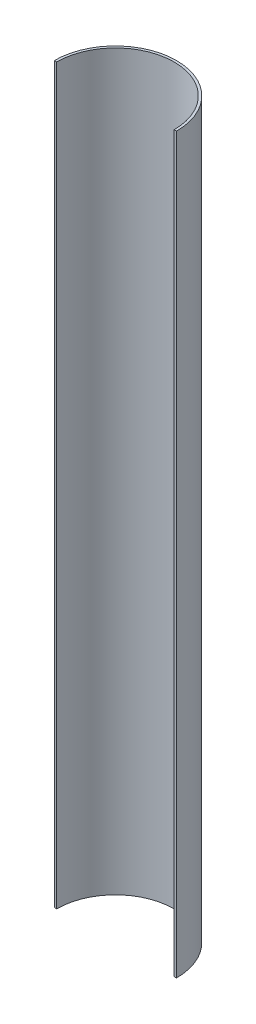
ISO-10303-21;
HEADER;
FILE_DESCRIPTION(('STEP AP214'),'2;1');
FILE_NAME('part.step','',(''),(''),'','','');
FILE_SCHEMA(('AUTOMOTIVE_DESIGN { 1 0 10303 214 1 1 1 1 }'));
ENDSEC;
DATA;
#1=APPLICATION_CONTEXT('core data for automotive mechanical design processes');
#2=APPLICATION_PROTOCOL_DEFINITION('international standard','automotive_design',2000,#1);
#3=PRODUCT_CONTEXT('',#1,'mechanical');
#4=PRODUCT('Part','Part','',(#3));
#5=PRODUCT_RELATED_PRODUCT_CATEGORY('part','',(#4));
#6=PRODUCT_DEFINITION_FORMATION('','',#4);
#7=PRODUCT_DEFINITION_CONTEXT('part definition',#1,'design');
#8=PRODUCT_DEFINITION('design','',#6,#7);
#9=PRODUCT_DEFINITION_SHAPE('','',#8);
#10=(LENGTH_UNIT() NAMED_UNIT(*) SI_UNIT(.MILLI.,.METRE.));
#11=(NAMED_UNIT(*) PLANE_ANGLE_UNIT() SI_UNIT($,.RADIAN.));
#12=(NAMED_UNIT(*) SI_UNIT($,.STERADIAN.) SOLID_ANGLE_UNIT());
#13=UNCERTAINTY_MEASURE_WITH_UNIT(LENGTH_MEASURE(1.E-05),#10,'distance_accuracy_value','');
#14=(GEOMETRIC_REPRESENTATION_CONTEXT(3) GLOBAL_UNCERTAINTY_ASSIGNED_CONTEXT((#13)) GLOBAL_UNIT_ASSIGNED_CONTEXT((#10,
#11,#12)) REPRESENTATION_CONTEXT('',''));
#15=CARTESIAN_POINT('',(0.,0.,0.));
#16=DIRECTION('',(0.,0.,1.));
#17=DIRECTION('',(1.,0.,0.));
#18=AXIS2_PLACEMENT_3D('',#15,#16,#17);
#19=CARTESIAN_POINT('',(0.,1500.,0.));
#20=DIRECTION('',(0.,0.,-1.));
#21=DIRECTION('',(-1.,0.,0.));
#22=AXIS2_PLACEMENT_3D('',#19,#20,#21);
#23=PLANE('',#22);
#24=DIRECTION('',(1.,0.,0.));
#25=VECTOR('',#24,1.);
#26=CARTESIAN_POINT('',(0.,0.,0.));
#27=LINE('',#26,#25);
#28=CARTESIAN_POINT('',(120.,0.,0.));
#29=VERTEX_POINT('',#28);
#30=CARTESIAN_POINT('',(125.,0.,0.));
#31=VERTEX_POINT('',#30);
#32=EDGE_CURVE('E116',#29,#31,#27,.T.);
#33=ORIENTED_EDGE('',*,*,#32,.T.);
#34=DIRECTION('',(0.,-1.,0.));
#35=VECTOR('',#34,1.);
#36=CARTESIAN_POINT('',(125.,1500.,0.));
#37=LINE('',#36,#35);
#38=CARTESIAN_POINT('',(125.,1500.,0.));
#39=VERTEX_POINT('',#38);
#40=EDGE_CURVE('E11',#39,#31,#37,.T.);
#41=ORIENTED_EDGE('',*,*,#40,.F.);
#42=DIRECTION('',(1.,0.,0.));
#43=VECTOR('',#42,1.);
#44=CARTESIAN_POINT('',(0.,1500.,0.));
#45=LINE('',#44,#43);
#46=CARTESIAN_POINT('',(120.,1500.,0.));
#47=VERTEX_POINT('',#46);
#48=EDGE_CURVE('E92',#47,#39,#45,.T.);
#49=ORIENTED_EDGE('',*,*,#48,.F.);
#50=DIRECTION('',(0.,-1.,0.));
#51=VECTOR('',#50,1.);
#52=CARTESIAN_POINT('',(120.,1500.,0.));
#53=LINE('',#52,#51);
#54=EDGE_CURVE('E59',#47,#29,#53,.T.);
#55=ORIENTED_EDGE('',*,*,#54,.T.);
#56=EDGE_LOOP('',(#33,#41,#49,#55));
#57=FACE_BOUND('',#56,.T.);
#58=ADVANCED_FACE('F41',(#57),#23,.F.);
#59=CARTESIAN_POINT('',(0.,1500.,0.));
#60=DIRECTION('',(0.,-1.,0.));
#61=DIRECTION('',(0.,0.,-1.));
#62=AXIS2_PLACEMENT_3D('',#59,#60,#61);
#63=CYLINDRICAL_SURFACE('',#62,125.);
#64=CARTESIAN_POINT('',(0.,0.,0.));
#65=DIRECTION('',(0.,1.,0.));
#66=DIRECTION('',(0.,0.,1.));
#67=AXIS2_PLACEMENT_3D('',#64,#65,#66);
#68=CIRCLE('',#67,125.);
#69=CARTESIAN_POINT('',(-125.,0.,0.));
#70=VERTEX_POINT('',#69);
#71=EDGE_CURVE('E97',#31,#70,#68,.T.);
#72=ORIENTED_EDGE('',*,*,#71,.T.);
#73=DIRECTION('',(0.,-1.,0.));
#74=VECTOR('',#73,1.);
#75=CARTESIAN_POINT('',(-125.,1500.,0.));
#76=LINE('',#75,#74);
#77=CARTESIAN_POINT('',(-125.,1500.,0.));
#78=VERTEX_POINT('',#77);
#79=EDGE_CURVE('E51',#78,#70,#76,.T.);
#80=ORIENTED_EDGE('',*,*,#79,.F.);
#81=CARTESIAN_POINT('',(0.,1500.,0.));
#82=DIRECTION('',(0.,1.,0.));
#83=DIRECTION('',(0.,0.,1.));
#84=AXIS2_PLACEMENT_3D('',#81,#82,#83);
#85=CIRCLE('',#84,125.);
#86=EDGE_CURVE('E85',#39,#78,#85,.T.);
#87=ORIENTED_EDGE('',*,*,#86,.F.);
#88=ORIENTED_EDGE('',*,*,#40,.T.);
#89=EDGE_LOOP('',(#72,#80,#87,#88));
#90=FACE_BOUND('',#89,.T.);
#91=ADVANCED_FACE('F43',(#90),#63,.T.);
#92=CARTESIAN_POINT('',(-120.,0.,0.));
#93=VERTEX_POINT('',#92);
#94=EDGE_CURVE('E111',#70,#93,#27,.T.);
#95=ORIENTED_EDGE('',*,*,#94,.T.);
#96=DIRECTION('',(0.,-1.,0.));
#97=VECTOR('',#96,1.);
#98=CARTESIAN_POINT('',(-120.,1500.,0.));
#99=LINE('',#98,#97);
#100=CARTESIAN_POINT('',(-120.,1500.,0.));
#101=VERTEX_POINT('',#100);
#102=EDGE_CURVE('E74',#101,#93,#99,.T.);
#103=ORIENTED_EDGE('',*,*,#102,.F.);
#104=EDGE_CURVE('E91',#78,#101,#45,.T.);
#105=ORIENTED_EDGE('',*,*,#104,.F.);
#106=ORIENTED_EDGE('',*,*,#79,.T.);
#107=EDGE_LOOP('',(#95,#103,#105,#106));
#108=FACE_BOUND('',#107,.T.);
#109=ADVANCED_FACE('F101',(#108),#23,.F.);
#110=CARTESIAN_POINT('',(0.,1500.,0.));
#111=DIRECTION('',(0.,-1.,0.));
#112=DIRECTION('',(0.,0.,-1.));
#113=AXIS2_PLACEMENT_3D('',#110,#111,#112);
#114=CYLINDRICAL_SURFACE('',#113,120.);
#115=CARTESIAN_POINT('',(0.,0.,0.));
#116=DIRECTION('',(0.,1.,0.));
#117=DIRECTION('',(0.,0.,1.));
#118=AXIS2_PLACEMENT_3D('',#115,#116,#117);
#119=CIRCLE('',#118,120.);
#120=EDGE_CURVE('E108',#29,#93,#119,.T.);
#121=ORIENTED_EDGE('',*,*,#120,.F.);
#122=ORIENTED_EDGE('',*,*,#54,.F.);
#123=CARTESIAN_POINT('',(0.,1500.,0.));
#124=DIRECTION('',(0.,1.,0.));
#125=DIRECTION('',(0.,0.,1.));
#126=AXIS2_PLACEMENT_3D('',#123,#124,#125);
#127=CIRCLE('',#126,120.);
#128=EDGE_CURVE('E103',#47,#101,#127,.T.);
#129=ORIENTED_EDGE('',*,*,#128,.T.);
#130=ORIENTED_EDGE('',*,*,#102,.T.);
#131=EDGE_LOOP('',(#121,#122,#129,#130));
#132=FACE_BOUND('',#131,.T.);
#133=ADVANCED_FACE('F125',(#132),#114,.F.);
#134=CARTESIAN_POINT('',(0.,1500.,0.));
#135=DIRECTION('',(0.,1.,0.));
#136=DIRECTION('',(0.,0.,1.));
#137=AXIS2_PLACEMENT_3D('',#134,#135,#136);
#138=PLANE('',#137);
#139=ORIENTED_EDGE('',*,*,#48,.T.);
#140=ORIENTED_EDGE('',*,*,#86,.T.);
#141=ORIENTED_EDGE('',*,*,#104,.T.);
#142=ORIENTED_EDGE('',*,*,#128,.F.);
#143=EDGE_LOOP('',(#139,#140,#141,#142));
#144=FACE_BOUND('',#143,.T.);
#145=ADVANCED_FACE('F88',(#144),#138,.T.);
#146=CARTESIAN_POINT('',(0.,0.,0.));
#147=DIRECTION('',(0.,1.,0.));
#148=DIRECTION('',(0.,0.,1.));
#149=AXIS2_PLACEMENT_3D('',#146,#147,#148);
#150=PLANE('',#149);
#151=ORIENTED_EDGE('',*,*,#32,.F.);
#152=ORIENTED_EDGE('',*,*,#120,.T.);
#153=ORIENTED_EDGE('',*,*,#94,.F.);
#154=ORIENTED_EDGE('',*,*,#71,.F.);
#155=EDGE_LOOP('',(#151,#152,#153,#154));
#156=FACE_BOUND('',#155,.T.);
#157=ADVANCED_FACE('F124',(#156),#150,.F.);
#158=CLOSED_SHELL('',(#58,#91,#109,#133,#145,#157));
#159=MANIFOLD_SOLID_BREP('B2',#158);
#160=ADVANCED_BREP_SHAPE_REPRESENTATION('',(#18,#159),#14);
#161=SHAPE_DEFINITION_REPRESENTATION(#9,#160);
ENDSEC;
END-ISO-10303-21;
